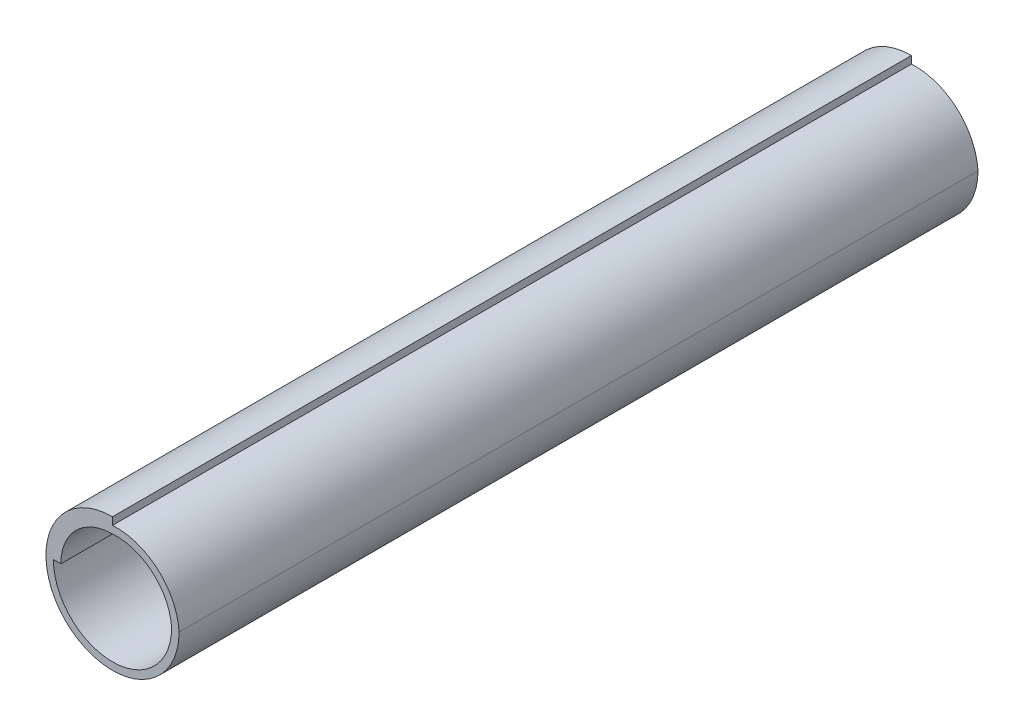
ISO-10303-21;
HEADER;
FILE_DESCRIPTION(('STEP AP214'),'2;1');
FILE_NAME('part.step','',(''),(''),'','','');
FILE_SCHEMA(('AUTOMOTIVE_DESIGN { 1 0 10303 214 1 1 1 1 }'));
ENDSEC;
DATA;
#1=APPLICATION_CONTEXT('core data for automotive mechanical design processes');
#2=APPLICATION_PROTOCOL_DEFINITION('international standard','automotive_design',2000,#1);
#3=PRODUCT_CONTEXT('',#1,'mechanical');
#4=PRODUCT('Part','Part','',(#3));
#5=PRODUCT_RELATED_PRODUCT_CATEGORY('part','',(#4));
#6=PRODUCT_DEFINITION_FORMATION('','',#4);
#7=PRODUCT_DEFINITION_CONTEXT('part definition',#1,'design');
#8=PRODUCT_DEFINITION('design','',#6,#7);
#9=PRODUCT_DEFINITION_SHAPE('','',#8);
#10=(LENGTH_UNIT() NAMED_UNIT(*) SI_UNIT(.MILLI.,.METRE.));
#11=(NAMED_UNIT(*) PLANE_ANGLE_UNIT() SI_UNIT($,.RADIAN.));
#12=(NAMED_UNIT(*) SI_UNIT($,.STERADIAN.) SOLID_ANGLE_UNIT());
#13=UNCERTAINTY_MEASURE_WITH_UNIT(LENGTH_MEASURE(1.E-05),#10,'distance_accuracy_value','');
#14=(GEOMETRIC_REPRESENTATION_CONTEXT(3) GLOBAL_UNCERTAINTY_ASSIGNED_CONTEXT((#13)) GLOBAL_UNIT_ASSIGNED_CONTEXT((#10,
#11,#12)) REPRESENTATION_CONTEXT('',''));
#15=CARTESIAN_POINT('',(0.,0.,0.));
#16=DIRECTION('',(0.,0.,1.));
#17=DIRECTION('',(1.,0.,0.));
#18=AXIS2_PLACEMENT_3D('',#15,#16,#17);
#19=CARTESIAN_POINT('',(0.140000000000028,-0.139999999999968,15.));
#20=DIRECTION('',(0.,0.,1.));
#21=DIRECTION('',(1.,0.,0.));
#22=AXIS2_PLACEMENT_3D('',#19,#20,#21);
#23=PLANE('',#22);
#24=CARTESIAN_POINT('',(0.140000000000028,-0.139999999999968,15.));
#25=DIRECTION('',(0.,0.,1.));
#26=DIRECTION('',(1.,0.,0.));
#27=AXIS2_PLACEMENT_3D('',#24,#25,#26);
#28=CIRCLE('',#27,2.36414889548012);
#29=CARTESIAN_POINT('',(2.5,0.,15.));
#30=VERTEX_POINT('',#29);
#31=CARTESIAN_POINT('',(0.,2.22,15.));
#32=VERTEX_POINT('',#31);
#33=EDGE_CURVE('E127',#30,#32,#28,.T.);
#34=ORIENTED_EDGE('',*,*,#33,.T.);
#35=DIRECTION('',(0.,1.,0.));
#36=VECTOR('',#35,1.);
#37=CARTESIAN_POINT('',(0.,2.22,15.));
#38=LINE('',#37,#36);
#39=CARTESIAN_POINT('',(0.,2.5,15.));
#40=VERTEX_POINT('',#39);
#41=EDGE_CURVE('E130',#32,#40,#38,.T.);
#42=ORIENTED_EDGE('',*,*,#41,.T.);
#43=CARTESIAN_POINT('',(0.,0.,15.));
#44=DIRECTION('',(0.,0.,1.));
#45=DIRECTION('',(1.,0.,0.));
#46=AXIS2_PLACEMENT_3D('',#43,#44,#45);
#47=CIRCLE('',#46,2.5);
#48=EDGE_CURVE('E133',#40,#30,#47,.T.);
#49=ORIENTED_EDGE('',*,*,#48,.T.);
#50=EDGE_LOOP('',(#34,#42,#49));
#51=FACE_BOUND('',#50,.T.);
#52=CARTESIAN_POINT('',(0.140000000000028,-0.139999999999968,15.));
#53=DIRECTION('',(0.,0.,1.));
#54=DIRECTION('',(1.,0.,0.));
#55=AXIS2_PLACEMENT_3D('',#52,#53,#54);
#56=CIRCLE('',#55,2.08470621431411);
#57=CARTESIAN_POINT('',(2.22,0.,15.));
#58=VERTEX_POINT('',#57);
#59=CARTESIAN_POINT('',(0.,1.94,15.));
#60=VERTEX_POINT('',#59);
#61=EDGE_CURVE('E99',#58,#60,#56,.T.);
#62=ORIENTED_EDGE('',*,*,#61,.F.);
#63=CARTESIAN_POINT('',(0.,0.,15.));
#64=DIRECTION('',(0.,0.,1.));
#65=DIRECTION('',(1.,0.,0.));
#66=AXIS2_PLACEMENT_3D('',#63,#64,#65);
#67=CIRCLE('',#66,2.22);
#68=CARTESIAN_POINT('',(-2.22,0.,15.));
#69=VERTEX_POINT('',#68);
#70=EDGE_CURVE('E91',#69,#58,#67,.T.);
#71=ORIENTED_EDGE('',*,*,#70,.F.);
#72=DIRECTION('',(-1.,0.,0.));
#73=VECTOR('',#72,1.);
#74=CARTESIAN_POINT('',(-2.22,0.,15.));
#75=LINE('',#74,#73);
#76=CARTESIAN_POINT('',(-1.94,0.,15.));
#77=VERTEX_POINT('',#76);
#78=EDGE_CURVE('E113',#77,#69,#75,.T.);
#79=ORIENTED_EDGE('',*,*,#78,.F.);
#80=CARTESIAN_POINT('',(0.,0.,15.));
#81=DIRECTION('',(0.,0.,1.));
#82=DIRECTION('',(1.,0.,0.));
#83=AXIS2_PLACEMENT_3D('',#80,#81,#82);
#84=CIRCLE('',#83,1.94);
#85=EDGE_CURVE('E111',#60,#77,#84,.T.);
#86=ORIENTED_EDGE('',*,*,#85,.F.);
#87=EDGE_LOOP('',(#62,#71,#79,#86));
#88=FACE_BOUND('',#87,.T.);
#89=ADVANCED_FACE('F32',(#51,#88),#23,.T.);
#90=CARTESIAN_POINT('',(0.140000000000028,-0.139999999999968,-15.));
#91=DIRECTION('',(0.,0.,1.));
#92=DIRECTION('',(1.,0.,0.));
#93=AXIS2_PLACEMENT_3D('',#90,#91,#92);
#94=PLANE('',#93);
#95=CARTESIAN_POINT('',(0.140000000000028,-0.139999999999968,-15.));
#96=DIRECTION('',(0.,0.,1.));
#97=DIRECTION('',(1.,0.,0.));
#98=AXIS2_PLACEMENT_3D('',#95,#96,#97);
#99=CIRCLE('',#98,2.36414889548012);
#100=CARTESIAN_POINT('',(2.5,0.,-15.));
#101=VERTEX_POINT('',#100);
#102=CARTESIAN_POINT('',(0.,2.22,-15.));
#103=VERTEX_POINT('',#102);
#104=EDGE_CURVE('E107',#101,#103,#99,.T.);
#105=ORIENTED_EDGE('',*,*,#104,.F.);
#106=CARTESIAN_POINT('',(0.,0.,-15.));
#107=DIRECTION('',(0.,0.,1.));
#108=DIRECTION('',(1.,0.,0.));
#109=AXIS2_PLACEMENT_3D('',#106,#107,#108);
#110=CIRCLE('',#109,2.5);
#111=CARTESIAN_POINT('',(0.,2.5,-15.));
#112=VERTEX_POINT('',#111);
#113=EDGE_CURVE('E131',#112,#101,#110,.T.);
#114=ORIENTED_EDGE('',*,*,#113,.F.);
#115=DIRECTION('',(0.,1.,0.));
#116=VECTOR('',#115,1.);
#117=CARTESIAN_POINT('',(0.,2.22,-15.));
#118=LINE('',#117,#116);
#119=EDGE_CURVE('E138',#103,#112,#118,.T.);
#120=ORIENTED_EDGE('',*,*,#119,.F.);
#121=EDGE_LOOP('',(#105,#114,#120));
#122=FACE_BOUND('',#121,.T.);
#123=CARTESIAN_POINT('',(0.,0.,-15.));
#124=DIRECTION('',(0.,0.,1.));
#125=DIRECTION('',(1.,0.,0.));
#126=AXIS2_PLACEMENT_3D('',#123,#124,#125);
#127=CIRCLE('',#126,2.22);
#128=CARTESIAN_POINT('',(-2.22,0.,-15.));
#129=VERTEX_POINT('',#128);
#130=CARTESIAN_POINT('',(2.22,0.,-15.));
#131=VERTEX_POINT('',#130);
#132=EDGE_CURVE('E55',#129,#131,#127,.T.);
#133=ORIENTED_EDGE('',*,*,#132,.T.);
#134=CARTESIAN_POINT('',(0.140000000000028,-0.139999999999968,-15.));
#135=DIRECTION('',(0.,0.,1.));
#136=DIRECTION('',(1.,0.,0.));
#137=AXIS2_PLACEMENT_3D('',#134,#135,#136);
#138=CIRCLE('',#137,2.08470621431411);
#139=CARTESIAN_POINT('',(0.,1.94,-15.));
#140=VERTEX_POINT('',#139);
#141=EDGE_CURVE('E106',#131,#140,#138,.T.);
#142=ORIENTED_EDGE('',*,*,#141,.T.);
#143=CARTESIAN_POINT('',(0.,0.,-15.));
#144=DIRECTION('',(0.,0.,1.));
#145=DIRECTION('',(1.,0.,0.));
#146=AXIS2_PLACEMENT_3D('',#143,#144,#145);
#147=CIRCLE('',#146,1.94);
#148=CARTESIAN_POINT('',(-1.94,0.,-15.));
#149=VERTEX_POINT('',#148);
#150=EDGE_CURVE('E119',#140,#149,#147,.T.);
#151=ORIENTED_EDGE('',*,*,#150,.T.);
#152=DIRECTION('',(-1.,0.,0.));
#153=VECTOR('',#152,1.);
#154=CARTESIAN_POINT('',(-2.22,0.,-15.));
#155=LINE('',#154,#153);
#156=EDGE_CURVE('E100',#149,#129,#155,.T.);
#157=ORIENTED_EDGE('',*,*,#156,.T.);
#158=EDGE_LOOP('',(#133,#142,#151,#157));
#159=FACE_BOUND('',#158,.T.);
#160=ADVANCED_FACE('F152',(#122,#159),#94,.F.);
#161=CARTESIAN_POINT('',(0.140000000000028,-0.139999999999968,15.));
#162=DIRECTION('',(0.,0.,-1.));
#163=DIRECTION('',(-1.,0.,0.));
#164=AXIS2_PLACEMENT_3D('',#161,#162,#163);
#165=CYLINDRICAL_SURFACE('',#164,2.36414889548012);
#166=ORIENTED_EDGE('',*,*,#104,.T.);
#167=DIRECTION('',(0.,0.,-1.));
#168=VECTOR('',#167,1.);
#169=CARTESIAN_POINT('',(0.,2.22,15.));
#170=LINE('',#169,#168);
#171=EDGE_CURVE('E11',#32,#103,#170,.T.);
#172=ORIENTED_EDGE('',*,*,#171,.F.);
#173=ORIENTED_EDGE('',*,*,#33,.F.);
#174=DIRECTION('',(0.,0.,-1.));
#175=VECTOR('',#174,1.);
#176=CARTESIAN_POINT('',(2.5,0.,15.));
#177=LINE('',#176,#175);
#178=EDGE_CURVE('E135',#30,#101,#177,.T.);
#179=ORIENTED_EDGE('',*,*,#178,.T.);
#180=EDGE_LOOP('',(#166,#172,#173,#179));
#181=FACE_BOUND('',#180,.T.);
#182=ADVANCED_FACE('F34',(#181),#165,.T.);
#183=CARTESIAN_POINT('',(0.,2.22,15.));
#184=DIRECTION('',(-1.,0.,0.));
#185=DIRECTION('',(0.,0.,1.));
#186=AXIS2_PLACEMENT_3D('',#183,#184,#185);
#187=PLANE('',#186);
#188=ORIENTED_EDGE('',*,*,#119,.T.);
#189=DIRECTION('',(0.,0.,-1.));
#190=VECTOR('',#189,1.);
#191=CARTESIAN_POINT('',(0.,2.5,15.));
#192=LINE('',#191,#190);
#193=EDGE_CURVE('E40',#40,#112,#192,.T.);
#194=ORIENTED_EDGE('',*,*,#193,.F.);
#195=ORIENTED_EDGE('',*,*,#41,.F.);
#196=ORIENTED_EDGE('',*,*,#171,.T.);
#197=EDGE_LOOP('',(#188,#194,#195,#196));
#198=FACE_BOUND('',#197,.T.);
#199=ADVANCED_FACE('F158',(#198),#187,.F.);
#200=CARTESIAN_POINT('',(0.,0.,15.));
#201=DIRECTION('',(0.,0.,-1.));
#202=DIRECTION('',(-1.,0.,0.));
#203=AXIS2_PLACEMENT_3D('',#200,#201,#202);
#204=CYLINDRICAL_SURFACE('',#203,2.5);
#205=ORIENTED_EDGE('',*,*,#113,.T.);
#206=ORIENTED_EDGE('',*,*,#178,.F.);
#207=ORIENTED_EDGE('',*,*,#48,.F.);
#208=ORIENTED_EDGE('',*,*,#193,.T.);
#209=EDGE_LOOP('',(#205,#206,#207,#208));
#210=FACE_BOUND('',#209,.T.);
#211=ADVANCED_FACE('F147',(#210),#204,.T.);
#212=CARTESIAN_POINT('',(0.,0.,15.));
#213=DIRECTION('',(0.,0.,-1.));
#214=DIRECTION('',(-1.,0.,0.));
#215=AXIS2_PLACEMENT_3D('',#212,#213,#214);
#216=CYLINDRICAL_SURFACE('',#215,2.22);
#217=ORIENTED_EDGE('',*,*,#132,.F.);
#218=DIRECTION('',(0.,0.,-1.));
#219=VECTOR('',#218,1.);
#220=CARTESIAN_POINT('',(-2.22,0.,15.));
#221=LINE('',#220,#219);
#222=EDGE_CURVE('E95',#69,#129,#221,.T.);
#223=ORIENTED_EDGE('',*,*,#222,.F.);
#224=ORIENTED_EDGE('',*,*,#70,.T.);
#225=DIRECTION('',(0.,0.,-1.));
#226=VECTOR('',#225,1.);
#227=CARTESIAN_POINT('',(2.22,0.,15.));
#228=LINE('',#227,#226);
#229=EDGE_CURVE('E94',#58,#131,#228,.T.);
#230=ORIENTED_EDGE('',*,*,#229,.T.);
#231=EDGE_LOOP('',(#217,#223,#224,#230));
#232=FACE_BOUND('',#231,.T.);
#233=ADVANCED_FACE('F93',(#232),#216,.F.);
#234=CARTESIAN_POINT('',(0.140000000000028,-0.139999999999968,15.));
#235=DIRECTION('',(0.,0.,-1.));
#236=DIRECTION('',(-1.,0.,0.));
#237=AXIS2_PLACEMENT_3D('',#234,#235,#236);
#238=CYLINDRICAL_SURFACE('',#237,2.08470621431411);
#239=ORIENTED_EDGE('',*,*,#141,.F.);
#240=ORIENTED_EDGE('',*,*,#229,.F.);
#241=ORIENTED_EDGE('',*,*,#61,.T.);
#242=DIRECTION('',(0.,0.,-1.));
#243=VECTOR('',#242,1.);
#244=CARTESIAN_POINT('',(0.,1.94,15.));
#245=LINE('',#244,#243);
#246=EDGE_CURVE('E108',#60,#140,#245,.T.);
#247=ORIENTED_EDGE('',*,*,#246,.T.);
#248=EDGE_LOOP('',(#239,#240,#241,#247));
#249=FACE_BOUND('',#248,.T.);
#250=ADVANCED_FACE('F103',(#249),#238,.F.);
#251=CARTESIAN_POINT('',(0.,0.,15.));
#252=DIRECTION('',(0.,0.,-1.));
#253=DIRECTION('',(-1.,0.,0.));
#254=AXIS2_PLACEMENT_3D('',#251,#252,#253);
#255=CYLINDRICAL_SURFACE('',#254,1.94);
#256=ORIENTED_EDGE('',*,*,#150,.F.);
#257=ORIENTED_EDGE('',*,*,#246,.F.);
#258=ORIENTED_EDGE('',*,*,#85,.T.);
#259=DIRECTION('',(0.,0.,-1.));
#260=VECTOR('',#259,1.);
#261=CARTESIAN_POINT('',(-1.94,0.,15.));
#262=LINE('',#261,#260);
#263=EDGE_CURVE('E47',#77,#149,#262,.T.);
#264=ORIENTED_EDGE('',*,*,#263,.T.);
#265=EDGE_LOOP('',(#256,#257,#258,#264));
#266=FACE_BOUND('',#265,.T.);
#267=ADVANCED_FACE('F176',(#266),#255,.F.);
#268=CARTESIAN_POINT('',(-2.22,0.,15.));
#269=DIRECTION('',(0.,-1.,0.));
#270=DIRECTION('',(0.,0.,-1.));
#271=AXIS2_PLACEMENT_3D('',#268,#269,#270);
#272=PLANE('',#271);
#273=ORIENTED_EDGE('',*,*,#156,.F.);
#274=ORIENTED_EDGE('',*,*,#263,.F.);
#275=ORIENTED_EDGE('',*,*,#78,.T.);
#276=ORIENTED_EDGE('',*,*,#222,.T.);
#277=EDGE_LOOP('',(#273,#274,#275,#276));
#278=FACE_BOUND('',#277,.T.);
#279=ADVANCED_FACE('F179',(#278),#272,.T.);
#280=CLOSED_SHELL('',(#89,#160,#182,#199,#211,#233,#250,#267,#279));
#281=MANIFOLD_SOLID_BREP('B2',#280);
#282=ADVANCED_BREP_SHAPE_REPRESENTATION('',(#18,#281),#14);
#283=SHAPE_DEFINITION_REPRESENTATION(#9,#282);
ENDSEC;
END-ISO-10303-21;
